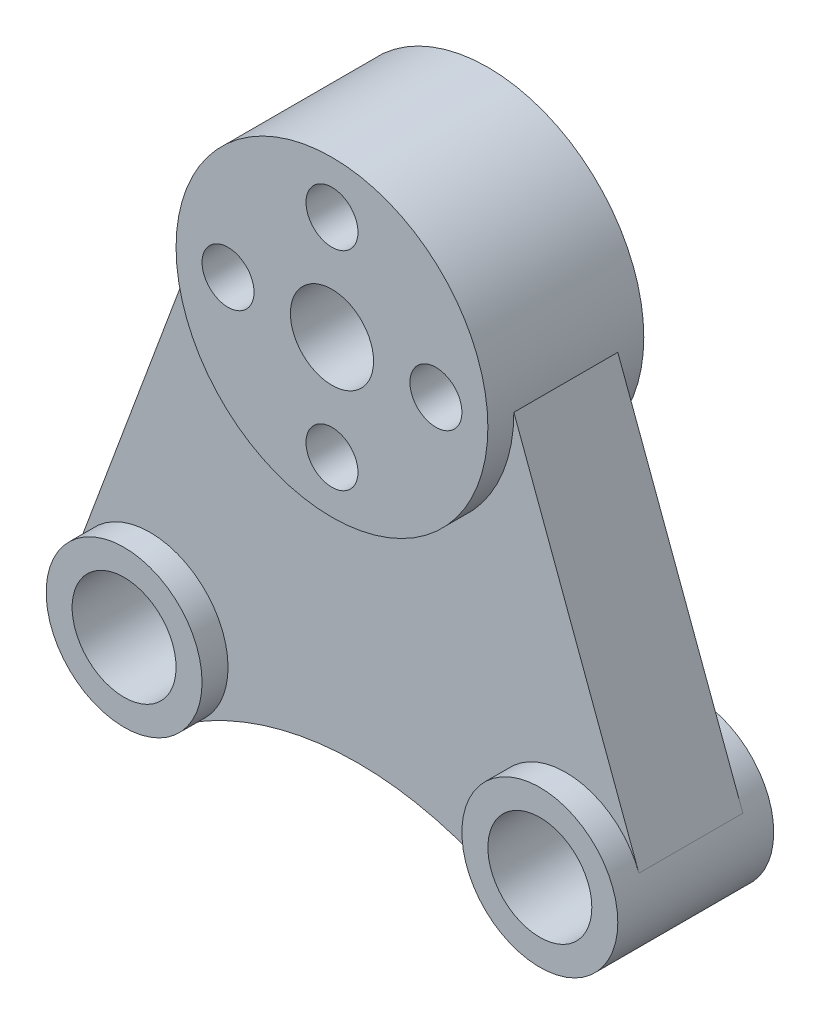
ISO-10303-21;
HEADER;
FILE_DESCRIPTION(('STEP AP214'),'2;1');
FILE_NAME('part.step','',(''),(''),'','','');
FILE_SCHEMA(('AUTOMOTIVE_DESIGN { 1 0 10303 214 1 1 1 1 }'));
ENDSEC;
DATA;
#1=APPLICATION_CONTEXT('core data for automotive mechanical design processes');
#2=APPLICATION_PROTOCOL_DEFINITION('international standard','automotive_design',2000,#1);
#3=PRODUCT_CONTEXT('',#1,'mechanical');
#4=PRODUCT('Part','Part','',(#3));
#5=PRODUCT_RELATED_PRODUCT_CATEGORY('part','',(#4));
#6=PRODUCT_DEFINITION_FORMATION('','',#4);
#7=PRODUCT_DEFINITION_CONTEXT('part definition',#1,'design');
#8=PRODUCT_DEFINITION('design','',#6,#7);
#9=PRODUCT_DEFINITION_SHAPE('','',#8);
#10=(LENGTH_UNIT() NAMED_UNIT(*) SI_UNIT(.MILLI.,.METRE.));
#11=(NAMED_UNIT(*) PLANE_ANGLE_UNIT() SI_UNIT($,.RADIAN.));
#12=(NAMED_UNIT(*) SI_UNIT($,.STERADIAN.) SOLID_ANGLE_UNIT());
#13=UNCERTAINTY_MEASURE_WITH_UNIT(LENGTH_MEASURE(1.E-05),#10,'distance_accuracy_value','');
#14=(GEOMETRIC_REPRESENTATION_CONTEXT(3) GLOBAL_UNCERTAINTY_ASSIGNED_CONTEXT((#13)) GLOBAL_UNIT_ASSIGNED_CONTEXT((#10,
#11,#12)) REPRESENTATION_CONTEXT('',''));
#15=CARTESIAN_POINT('',(0.,0.,0.));
#16=DIRECTION('',(0.,0.,1.));
#17=DIRECTION('',(1.,0.,0.));
#18=AXIS2_PLACEMENT_3D('',#15,#16,#17);
#19=CARTESIAN_POINT('',(-40.,-70.,15.));
#20=DIRECTION('',(0.,0.,-1.));
#21=DIRECTION('',(-1.,0.,0.));
#22=AXIS2_PLACEMENT_3D('',#19,#20,#21);
#23=CYLINDRICAL_SURFACE('',#22,10.);
#24=CARTESIAN_POINT('',(-40.,-70.,15.));
#25=DIRECTION('',(0.,0.,1.));
#26=DIRECTION('',(1.,0.,0.));
#27=AXIS2_PLACEMENT_3D('',#24,#25,#26);
#28=CIRCLE('',#27,10.);
#29=CARTESIAN_POINT('',(-30.,-70.,15.));
#30=VERTEX_POINT('',#29);
#31=EDGE_CURVE('E41',#30,#30,#28,.T.);
#32=ORIENTED_EDGE('',*,*,#31,.T.);
#33=EDGE_LOOP('',(#32));
#34=FACE_BOUND('',#33,.T.);
#35=CARTESIAN_POINT('',(-40.,-70.,-15.));
#36=DIRECTION('',(0.,0.,1.));
#37=DIRECTION('',(1.,0.,0.));
#38=AXIS2_PLACEMENT_3D('',#35,#36,#37);
#39=CIRCLE('',#38,10.);
#40=CARTESIAN_POINT('',(-30.,-70.,-15.));
#41=VERTEX_POINT('',#40);
#42=EDGE_CURVE('E125',#41,#41,#39,.T.);
#43=ORIENTED_EDGE('',*,*,#42,.F.);
#44=EDGE_LOOP('',(#43));
#45=FACE_BOUND('',#44,.T.);
#46=ADVANCED_FACE('F33',(#34,#45),#23,.F.);
#47=CARTESIAN_POINT('',(-40.,-70.,15.));
#48=DIRECTION('',(0.,0.,-1.));
#49=DIRECTION('',(-1.,0.,0.));
#50=AXIS2_PLACEMENT_3D('',#47,#48,#49);
#51=CYLINDRICAL_SURFACE('',#50,15.);
#52=DIRECTION('',(0.,0.,-1.));
#53=VECTOR('',#52,1.);
#54=CARTESIAN_POINT('',(-32.,-82.6885775404495,10.));
#55=LINE('',#54,#53);
#56=CARTESIAN_POINT('',(-32.,-82.6885775404495,10.));
#57=VERTEX_POINT('',#56);
#58=CARTESIAN_POINT('',(-32.,-82.6885775404495,-10.));
#59=VERTEX_POINT('',#58);
#60=EDGE_CURVE('E49',#57,#59,#55,.T.);
#61=ORIENTED_EDGE('',*,*,#60,.F.);
#62=CARTESIAN_POINT('',(-40.,-70.,10.));
#63=DIRECTION('',(0.,0.,1.));
#64=DIRECTION('',(1.,0.,0.));
#65=AXIS2_PLACEMENT_3D('',#62,#63,#64);
#66=CIRCLE('',#65,15.);
#67=CARTESIAN_POINT('',(-54.0612887091395,-64.7769587558372,10.));
#68=VERTEX_POINT('',#67);
#69=EDGE_CURVE('E54',#57,#68,#66,.T.);
#70=ORIENTED_EDGE('',*,*,#69,.T.);
#71=DIRECTION('',(0.,0.,-1.));
#72=VECTOR('',#71,1.);
#73=CARTESIAN_POINT('',(-54.0612887091395,-64.7769587558372,10.));
#74=LINE('',#73,#72);
#75=CARTESIAN_POINT('',(-54.0612887091395,-64.7769587558372,-10.));
#76=VERTEX_POINT('',#75);
#77=EDGE_CURVE('E107',#68,#76,#74,.T.);
#78=ORIENTED_EDGE('',*,*,#77,.T.);
#79=CARTESIAN_POINT('',(-40.,-70.,-10.));
#80=DIRECTION('',(0.,0.,1.));
#81=DIRECTION('',(1.,0.,0.));
#82=AXIS2_PLACEMENT_3D('',#79,#80,#81);
#83=CIRCLE('',#82,15.);
#84=EDGE_CURVE('E111',#59,#76,#83,.T.);
#85=ORIENTED_EDGE('',*,*,#84,.F.);
#86=EDGE_LOOP('',(#61,#70,#78,#85));
#87=FACE_BOUND('',#86,.T.);
#88=CARTESIAN_POINT('',(-40.,-70.,15.));
#89=DIRECTION('',(0.,0.,1.));
#90=DIRECTION('',(1.,0.,0.));
#91=AXIS2_PLACEMENT_3D('',#88,#89,#90);
#92=CIRCLE('',#91,15.);
#93=CARTESIAN_POINT('',(-25.,-70.,15.));
#94=VERTEX_POINT('',#93);
#95=EDGE_CURVE('E11',#94,#94,#92,.T.);
#96=ORIENTED_EDGE('',*,*,#95,.F.);
#97=EDGE_LOOP('',(#96));
#98=FACE_BOUND('',#97,.T.);
#99=CARTESIAN_POINT('',(-40.,-70.,-15.));
#100=DIRECTION('',(0.,0.,1.));
#101=DIRECTION('',(1.,0.,0.));
#102=AXIS2_PLACEMENT_3D('',#99,#100,#101);
#103=CIRCLE('',#102,15.);
#104=CARTESIAN_POINT('',(-25.,-70.,-15.));
#105=VERTEX_POINT('',#104);
#106=EDGE_CURVE('E36',#105,#105,#103,.T.);
#107=ORIENTED_EDGE('',*,*,#106,.T.);
#108=EDGE_LOOP('',(#107));
#109=FACE_BOUND('',#108,.T.);
#110=ADVANCED_FACE('F133',(#87,#98,#109),#51,.T.);
#111=CARTESIAN_POINT('',(0.,0.,15.));
#112=DIRECTION('',(0.,0.,1.));
#113=DIRECTION('',(1.,0.,0.));
#114=AXIS2_PLACEMENT_3D('',#111,#112,#113);
#115=PLANE('',#114);
#116=ORIENTED_EDGE('',*,*,#31,.F.);
#117=EDGE_LOOP('',(#116));
#118=FACE_BOUND('',#117,.T.);
#119=ORIENTED_EDGE('',*,*,#95,.T.);
#120=EDGE_LOOP('',(#119));
#121=FACE_BOUND('',#120,.T.);
#122=ADVANCED_FACE('F138',(#118,#121),#115,.T.);
#123=CARTESIAN_POINT('',(0.,0.,-15.));
#124=DIRECTION('',(0.,0.,1.));
#125=DIRECTION('',(1.,0.,0.));
#126=AXIS2_PLACEMENT_3D('',#123,#124,#125);
#127=PLANE('',#126);
#128=ORIENTED_EDGE('',*,*,#42,.T.);
#129=EDGE_LOOP('',(#128));
#130=FACE_BOUND('',#129,.T.);
#131=ORIENTED_EDGE('',*,*,#106,.F.);
#132=EDGE_LOOP('',(#131));
#133=FACE_BOUND('',#132,.T.);
#134=ADVANCED_FACE('F135',(#130,#133),#127,.F.);
#135=CARTESIAN_POINT('',(0.,-133.442887702248,10.));
#136=DIRECTION('',(0.,0.,-1.));
#137=DIRECTION('',(-1.,0.,0.));
#138=AXIS2_PLACEMENT_3D('',#135,#136,#137);
#139=CYLINDRICAL_SURFACE('',#138,60.);
#140=CARTESIAN_POINT('',(0.,-133.442887702248,-10.));
#141=DIRECTION('',(0.,0.,1.));
#142=DIRECTION('',(1.,0.,0.));
#143=AXIS2_PLACEMENT_3D('',#140,#141,#142);
#144=CIRCLE('',#143,60.);
#145=CARTESIAN_POINT('',(32.,-82.6885775404495,-10.));
#146=VERTEX_POINT('',#145);
#147=EDGE_CURVE('E340',#59,#146,#144,.F.);
#148=ORIENTED_EDGE('',*,*,#147,.T.);
#149=DIRECTION('',(0.,0.,-1.));
#150=VECTOR('',#149,1.);
#151=CARTESIAN_POINT('',(32.,-82.6885775404495,10.));
#152=LINE('',#151,#150);
#153=CARTESIAN_POINT('',(32.,-82.6885775404495,10.));
#154=VERTEX_POINT('',#153);
#155=EDGE_CURVE('E122',#154,#146,#152,.T.);
#156=ORIENTED_EDGE('',*,*,#155,.F.);
#157=CARTESIAN_POINT('',(0.,-133.442887702248,10.));
#158=DIRECTION('',(0.,0.,1.));
#159=DIRECTION('',(1.,0.,0.));
#160=AXIS2_PLACEMENT_3D('',#157,#158,#159);
#161=CIRCLE('',#160,60.);
#162=EDGE_CURVE('E113',#57,#154,#161,.F.);
#163=ORIENTED_EDGE('',*,*,#162,.F.);
#164=ORIENTED_EDGE('',*,*,#60,.T.);
#165=EDGE_LOOP('',(#148,#156,#163,#164));
#166=FACE_BOUND('',#165,.T.);
#167=ADVANCED_FACE('F137',(#166),#139,.F.);
#168=CARTESIAN_POINT('',(26.3626453549032,9.79235878318883,10.));
#169=DIRECTION('',(0.937419247275968,0.348202749610853,0.));
#170=DIRECTION('',(-0.348202749610853,0.937419247275968,0.));
#171=AXIS2_PLACEMENT_3D('',#168,#169,#170);
#172=PLANE('',#171);
#173=DIRECTION('',(0.348202749610853,-0.937419247275968,0.));
#174=VECTOR('',#173,1.);
#175=CARTESIAN_POINT('',(26.3626453549032,9.79235878318883,-10.));
#176=LINE('',#175,#174);
#177=CARTESIAN_POINT('',(30.,0.,-10.));
#178=VERTEX_POINT('',#177);
#179=CARTESIAN_POINT('',(54.0612887091395,-64.7769587558372,-10.));
#180=VERTEX_POINT('',#179);
#181=EDGE_CURVE('E98',#178,#180,#176,.T.);
#182=ORIENTED_EDGE('',*,*,#181,.F.);
#183=DIRECTION('',(0.,0.,-1.));
#184=VECTOR('',#183,1.);
#185=CARTESIAN_POINT('',(30.,0.,10.));
#186=LINE('',#185,#184);
#187=CARTESIAN_POINT('',(30.,0.,10.));
#188=VERTEX_POINT('',#187);
#189=EDGE_CURVE('E92',#188,#178,#186,.T.);
#190=ORIENTED_EDGE('',*,*,#189,.F.);
#191=DIRECTION('',(0.348202749610853,-0.937419247275968,0.));
#192=VECTOR('',#191,1.);
#193=CARTESIAN_POINT('',(26.3626453549032,9.79235878318883,10.));
#194=LINE('',#193,#192);
#195=CARTESIAN_POINT('',(54.0612887091395,-64.7769587558372,10.));
#196=VERTEX_POINT('',#195);
#197=EDGE_CURVE('E349',#188,#196,#194,.T.);
#198=ORIENTED_EDGE('',*,*,#197,.T.);
#199=DIRECTION('',(0.,0.,-1.));
#200=VECTOR('',#199,1.);
#201=CARTESIAN_POINT('',(54.0612887091395,-64.7769587558372,10.));
#202=LINE('',#201,#200);
#203=EDGE_CURVE('E119',#196,#180,#202,.T.);
#204=ORIENTED_EDGE('',*,*,#203,.T.);
#205=EDGE_LOOP('',(#182,#190,#198,#204));
#206=FACE_BOUND('',#205,.T.);
#207=ADVANCED_FACE('F144',(#206),#172,.T.);
#208=CARTESIAN_POINT('',(-26.3626453549033,9.79235878318883,10.));
#209=DIRECTION('',(0.937419247275968,-0.348202749610853,0.));
#210=DIRECTION('',(0.348202749610853,0.937419247275968,0.));
#211=AXIS2_PLACEMENT_3D('',#208,#209,#210);
#212=PLANE('',#211);
#213=DIRECTION('',(-0.348202749610853,-0.937419247275968,0.));
#214=VECTOR('',#213,1.);
#215=CARTESIAN_POINT('',(-26.3626453549033,9.79235878318883,-10.));
#216=LINE('',#215,#214);
#217=CARTESIAN_POINT('',(-30.,0.,-10.));
#218=VERTEX_POINT('',#217);
#219=EDGE_CURVE('E97',#218,#76,#216,.T.);
#220=ORIENTED_EDGE('',*,*,#219,.T.);
#221=ORIENTED_EDGE('',*,*,#77,.F.);
#222=DIRECTION('',(-0.348202749610853,-0.937419247275968,0.));
#223=VECTOR('',#222,1.);
#224=CARTESIAN_POINT('',(-26.3626453549033,9.79235878318883,10.));
#225=LINE('',#224,#223);
#226=CARTESIAN_POINT('',(-30.,0.,10.));
#227=VERTEX_POINT('',#226);
#228=EDGE_CURVE('E105',#227,#68,#225,.T.);
#229=ORIENTED_EDGE('',*,*,#228,.F.);
#230=DIRECTION('',(0.,0.,-1.));
#231=VECTOR('',#230,1.);
#232=CARTESIAN_POINT('',(-30.,0.,10.));
#233=LINE('',#232,#231);
#234=EDGE_CURVE('E89',#227,#218,#233,.T.);
#235=ORIENTED_EDGE('',*,*,#234,.T.);
#236=EDGE_LOOP('',(#220,#221,#229,#235));
#237=FACE_BOUND('',#236,.T.);
#238=ADVANCED_FACE('F102',(#237),#212,.F.);
#239=CARTESIAN_POINT('',(0.,0.,10.));
#240=DIRECTION('',(0.,0.,1.));
#241=DIRECTION('',(1.,0.,0.));
#242=AXIS2_PLACEMENT_3D('',#239,#240,#241);
#243=PLANE('',#242);
#244=ORIENTED_EDGE('',*,*,#69,.F.);
#245=ORIENTED_EDGE('',*,*,#162,.T.);
#246=CARTESIAN_POINT('',(40.,-70.,10.));
#247=DIRECTION('',(0.,0.,1.));
#248=DIRECTION('',(1.,0.,0.));
#249=AXIS2_PLACEMENT_3D('',#246,#247,#248);
#250=CIRCLE('',#249,15.);
#251=EDGE_CURVE('E351',#196,#154,#250,.T.);
#252=ORIENTED_EDGE('',*,*,#251,.F.);
#253=ORIENTED_EDGE('',*,*,#197,.F.);
#254=CARTESIAN_POINT('',(0.,0.,10.));
#255=DIRECTION('',(0.,0.,1.));
#256=DIRECTION('',(1.,0.,0.));
#257=AXIS2_PLACEMENT_3D('',#254,#255,#256);
#258=CIRCLE('',#257,30.);
#259=EDGE_CURVE('E338',#227,#188,#258,.T.);
#260=ORIENTED_EDGE('',*,*,#259,.F.);
#261=ORIENTED_EDGE('',*,*,#228,.T.);
#262=EDGE_LOOP('',(#244,#245,#252,#253,#260,#261));
#263=FACE_BOUND('',#262,.T.);
#264=ADVANCED_FACE('F301',(#263),#243,.T.);
#265=CARTESIAN_POINT('',(0.,0.,-10.));
#266=DIRECTION('',(0.,0.,1.));
#267=DIRECTION('',(1.,0.,0.));
#268=AXIS2_PLACEMENT_3D('',#265,#266,#267);
#269=PLANE('',#268);
#270=ORIENTED_EDGE('',*,*,#84,.T.);
#271=ORIENTED_EDGE('',*,*,#219,.F.);
#272=CARTESIAN_POINT('',(0.,0.,-10.));
#273=DIRECTION('',(0.,0.,1.));
#274=DIRECTION('',(1.,0.,0.));
#275=AXIS2_PLACEMENT_3D('',#272,#273,#274);
#276=CIRCLE('',#275,30.);
#277=EDGE_CURVE('E85',#218,#178,#276,.T.);
#278=ORIENTED_EDGE('',*,*,#277,.T.);
#279=ORIENTED_EDGE('',*,*,#181,.T.);
#280=CARTESIAN_POINT('',(40.,-70.,-10.));
#281=DIRECTION('',(0.,0.,1.));
#282=DIRECTION('',(1.,0.,0.));
#283=AXIS2_PLACEMENT_3D('',#280,#281,#282);
#284=CIRCLE('',#283,15.);
#285=EDGE_CURVE('E345',#180,#146,#284,.T.);
#286=ORIENTED_EDGE('',*,*,#285,.T.);
#287=ORIENTED_EDGE('',*,*,#147,.F.);
#288=EDGE_LOOP('',(#270,#271,#278,#279,#286,#287));
#289=FACE_BOUND('',#288,.T.);
#290=ADVANCED_FACE('F109',(#289),#269,.F.);
#291=CARTESIAN_POINT('',(40.,-70.,15.));
#292=DIRECTION('',(0.,0.,-1.));
#293=DIRECTION('',(-1.,0.,0.));
#294=AXIS2_PLACEMENT_3D('',#291,#292,#293);
#295=CYLINDRICAL_SURFACE('',#294,10.);
#296=CARTESIAN_POINT('',(40.,-70.,15.));
#297=DIRECTION('',(0.,0.,1.));
#298=DIRECTION('',(1.,0.,0.));
#299=AXIS2_PLACEMENT_3D('',#296,#297,#298);
#300=CIRCLE('',#299,10.);
#301=CARTESIAN_POINT('',(50.,-70.,15.));
#302=VERTEX_POINT('',#301);
#303=EDGE_CURVE('E360',#302,#302,#300,.T.);
#304=ORIENTED_EDGE('',*,*,#303,.T.);
#305=EDGE_LOOP('',(#304));
#306=FACE_BOUND('',#305,.T.);
#307=CARTESIAN_POINT('',(40.,-70.,-15.));
#308=DIRECTION('',(0.,0.,1.));
#309=DIRECTION('',(1.,0.,0.));
#310=AXIS2_PLACEMENT_3D('',#307,#308,#309);
#311=CIRCLE('',#310,10.);
#312=CARTESIAN_POINT('',(50.,-70.,-15.));
#313=VERTEX_POINT('',#312);
#314=EDGE_CURVE('E361',#313,#313,#311,.T.);
#315=ORIENTED_EDGE('',*,*,#314,.F.);
#316=EDGE_LOOP('',(#315));
#317=FACE_BOUND('',#316,.T.);
#318=ADVANCED_FACE('F177',(#306,#317),#295,.F.);
#319=CARTESIAN_POINT('',(40.,-70.,15.));
#320=DIRECTION('',(0.,0.,-1.));
#321=DIRECTION('',(-1.,0.,0.));
#322=AXIS2_PLACEMENT_3D('',#319,#320,#321);
#323=CYLINDRICAL_SURFACE('',#322,15.);
#324=ORIENTED_EDGE('',*,*,#251,.T.);
#325=ORIENTED_EDGE('',*,*,#155,.T.);
#326=ORIENTED_EDGE('',*,*,#285,.F.);
#327=ORIENTED_EDGE('',*,*,#203,.F.);
#328=EDGE_LOOP('',(#324,#325,#326,#327));
#329=FACE_BOUND('',#328,.T.);
#330=CARTESIAN_POINT('',(40.,-70.,15.));
#331=DIRECTION('',(0.,0.,1.));
#332=DIRECTION('',(1.,0.,0.));
#333=AXIS2_PLACEMENT_3D('',#330,#331,#332);
#334=CIRCLE('',#333,15.);
#335=CARTESIAN_POINT('',(55.,-70.,15.));
#336=VERTEX_POINT('',#335);
#337=EDGE_CURVE('E341',#336,#336,#334,.T.);
#338=ORIENTED_EDGE('',*,*,#337,.F.);
#339=EDGE_LOOP('',(#338));
#340=FACE_BOUND('',#339,.T.);
#341=CARTESIAN_POINT('',(40.,-70.,-15.));
#342=DIRECTION('',(0.,0.,1.));
#343=DIRECTION('',(1.,0.,0.));
#344=AXIS2_PLACEMENT_3D('',#341,#342,#343);
#345=CIRCLE('',#344,15.);
#346=CARTESIAN_POINT('',(55.,-70.,-15.));
#347=VERTEX_POINT('',#346);
#348=EDGE_CURVE('E357',#347,#347,#345,.T.);
#349=ORIENTED_EDGE('',*,*,#348,.T.);
#350=EDGE_LOOP('',(#349));
#351=FACE_BOUND('',#350,.T.);
#352=ADVANCED_FACE('F183',(#329,#340,#351),#323,.T.);
#353=CARTESIAN_POINT('',(0.,0.,15.));
#354=DIRECTION('',(0.,0.,1.));
#355=DIRECTION('',(1.,0.,0.));
#356=AXIS2_PLACEMENT_3D('',#353,#354,#355);
#357=PLANE('',#356);
#358=ORIENTED_EDGE('',*,*,#303,.F.);
#359=EDGE_LOOP('',(#358));
#360=FACE_BOUND('',#359,.T.);
#361=ORIENTED_EDGE('',*,*,#337,.T.);
#362=EDGE_LOOP('',(#361));
#363=FACE_BOUND('',#362,.T.);
#364=ADVANCED_FACE('F193',(#360,#363),#357,.T.);
#365=CARTESIAN_POINT('',(0.,0.,-15.));
#366=DIRECTION('',(0.,0.,1.));
#367=DIRECTION('',(1.,0.,0.));
#368=AXIS2_PLACEMENT_3D('',#365,#366,#367);
#369=PLANE('',#368);
#370=ORIENTED_EDGE('',*,*,#314,.T.);
#371=EDGE_LOOP('',(#370));
#372=FACE_BOUND('',#371,.T.);
#373=ORIENTED_EDGE('',*,*,#348,.F.);
#374=EDGE_LOOP('',(#373));
#375=FACE_BOUND('',#374,.T.);
#376=ADVANCED_FACE('F202',(#372,#375),#369,.F.);
#377=CARTESIAN_POINT('',(0.,0.,15.));
#378=DIRECTION('',(0.,0.,-1.));
#379=DIRECTION('',(-1.,0.,0.));
#380=AXIS2_PLACEMENT_3D('',#377,#378,#379);
#381=CYLINDRICAL_SURFACE('',#380,8.);
#382=CARTESIAN_POINT('',(0.,0.,15.));
#383=DIRECTION('',(0.,0.,1.));
#384=DIRECTION('',(1.,0.,0.));
#385=AXIS2_PLACEMENT_3D('',#382,#383,#384);
#386=CIRCLE('',#385,8.);
#387=CARTESIAN_POINT('',(8.,0.,15.));
#388=VERTEX_POINT('',#387);
#389=EDGE_CURVE('E390',#388,#388,#386,.T.);
#390=ORIENTED_EDGE('',*,*,#389,.T.);
#391=EDGE_LOOP('',(#390));
#392=FACE_BOUND('',#391,.T.);
#393=CARTESIAN_POINT('',(0.,0.,-15.));
#394=DIRECTION('',(0.,0.,1.));
#395=DIRECTION('',(1.,0.,0.));
#396=AXIS2_PLACEMENT_3D('',#393,#394,#395);
#397=CIRCLE('',#396,8.);
#398=CARTESIAN_POINT('',(8.,0.,-15.));
#399=VERTEX_POINT('',#398);
#400=EDGE_CURVE('E373',#399,#399,#397,.T.);
#401=ORIENTED_EDGE('',*,*,#400,.F.);
#402=EDGE_LOOP('',(#401));
#403=FACE_BOUND('',#402,.T.);
#404=ADVANCED_FACE('F211',(#392,#403),#381,.F.);
#405=CARTESIAN_POINT('',(0.,20.,15.));
#406=DIRECTION('',(0.,0.,-1.));
#407=DIRECTION('',(-1.,0.,0.));
#408=AXIS2_PLACEMENT_3D('',#405,#406,#407);
#409=CYLINDRICAL_SURFACE('',#408,5.);
#410=CARTESIAN_POINT('',(0.,20.,15.));
#411=DIRECTION('',(0.,0.,1.));
#412=DIRECTION('',(1.,0.,0.));
#413=AXIS2_PLACEMENT_3D('',#410,#411,#412);
#414=CIRCLE('',#413,5.);
#415=CARTESIAN_POINT('',(5.,20.,15.));
#416=VERTEX_POINT('',#415);
#417=EDGE_CURVE('E393',#416,#416,#414,.T.);
#418=ORIENTED_EDGE('',*,*,#417,.T.);
#419=EDGE_LOOP('',(#418));
#420=FACE_BOUND('',#419,.T.);
#421=CARTESIAN_POINT('',(0.,20.,-15.));
#422=DIRECTION('',(0.,0.,1.));
#423=DIRECTION('',(1.,0.,0.));
#424=AXIS2_PLACEMENT_3D('',#421,#422,#423);
#425=CIRCLE('',#424,5.);
#426=CARTESIAN_POINT('',(5.,20.,-15.));
#427=VERTEX_POINT('',#426);
#428=EDGE_CURVE('E376',#427,#427,#425,.T.);
#429=ORIENTED_EDGE('',*,*,#428,.F.);
#430=EDGE_LOOP('',(#429));
#431=FACE_BOUND('',#430,.T.);
#432=ADVANCED_FACE('F220',(#420,#431),#409,.F.);
#433=CARTESIAN_POINT('',(-20.,0.,15.));
#434=DIRECTION('',(0.,0.,-1.));
#435=DIRECTION('',(-1.,0.,0.));
#436=AXIS2_PLACEMENT_3D('',#433,#434,#435);
#437=CYLINDRICAL_SURFACE('',#436,5.);
#438=CARTESIAN_POINT('',(-20.,0.,15.));
#439=DIRECTION('',(0.,0.,1.));
#440=DIRECTION('',(1.,0.,0.));
#441=AXIS2_PLACEMENT_3D('',#438,#439,#440);
#442=CIRCLE('',#441,5.);
#443=CARTESIAN_POINT('',(-15.,0.,15.));
#444=VERTEX_POINT('',#443);
#445=EDGE_CURVE('E396',#444,#444,#442,.T.);
#446=ORIENTED_EDGE('',*,*,#445,.T.);
#447=EDGE_LOOP('',(#446));
#448=FACE_BOUND('',#447,.T.);
#449=CARTESIAN_POINT('',(-20.,0.,-15.));
#450=DIRECTION('',(0.,0.,1.));
#451=DIRECTION('',(1.,0.,0.));
#452=AXIS2_PLACEMENT_3D('',#449,#450,#451);
#453=CIRCLE('',#452,5.);
#454=CARTESIAN_POINT('',(-15.,0.,-15.));
#455=VERTEX_POINT('',#454);
#456=EDGE_CURVE('E379',#455,#455,#453,.T.);
#457=ORIENTED_EDGE('',*,*,#456,.F.);
#458=EDGE_LOOP('',(#457));
#459=FACE_BOUND('',#458,.T.);
#460=ADVANCED_FACE('F229',(#448,#459),#437,.F.);
#461=CARTESIAN_POINT('',(0.,-20.,15.));
#462=DIRECTION('',(0.,0.,-1.));
#463=DIRECTION('',(-1.,0.,0.));
#464=AXIS2_PLACEMENT_3D('',#461,#462,#463);
#465=CYLINDRICAL_SURFACE('',#464,5.);
#466=CARTESIAN_POINT('',(0.,-20.,15.));
#467=DIRECTION('',(0.,0.,1.));
#468=DIRECTION('',(1.,0.,0.));
#469=AXIS2_PLACEMENT_3D('',#466,#467,#468);
#470=CIRCLE('',#469,5.);
#471=CARTESIAN_POINT('',(5.,-20.,15.));
#472=VERTEX_POINT('',#471);
#473=EDGE_CURVE('E399',#472,#472,#470,.T.);
#474=ORIENTED_EDGE('',*,*,#473,.T.);
#475=EDGE_LOOP('',(#474));
#476=FACE_BOUND('',#475,.T.);
#477=CARTESIAN_POINT('',(0.,-20.,-15.));
#478=DIRECTION('',(0.,0.,1.));
#479=DIRECTION('',(1.,0.,0.));
#480=AXIS2_PLACEMENT_3D('',#477,#478,#479);
#481=CIRCLE('',#480,5.);
#482=CARTESIAN_POINT('',(5.,-20.,-15.));
#483=VERTEX_POINT('',#482);
#484=EDGE_CURVE('E382',#483,#483,#481,.T.);
#485=ORIENTED_EDGE('',*,*,#484,.F.);
#486=EDGE_LOOP('',(#485));
#487=FACE_BOUND('',#486,.T.);
#488=ADVANCED_FACE('F238',(#476,#487),#465,.F.);
#489=CARTESIAN_POINT('',(20.,0.,15.));
#490=DIRECTION('',(0.,0.,-1.));
#491=DIRECTION('',(-1.,0.,0.));
#492=AXIS2_PLACEMENT_3D('',#489,#490,#491);
#493=CYLINDRICAL_SURFACE('',#492,5.);
#494=CARTESIAN_POINT('',(20.,0.,15.));
#495=DIRECTION('',(0.,0.,1.));
#496=DIRECTION('',(1.,0.,0.));
#497=AXIS2_PLACEMENT_3D('',#494,#495,#496);
#498=CIRCLE('',#497,5.);
#499=CARTESIAN_POINT('',(25.,0.,15.));
#500=VERTEX_POINT('',#499);
#501=EDGE_CURVE('E372',#500,#500,#498,.T.);
#502=ORIENTED_EDGE('',*,*,#501,.T.);
#503=EDGE_LOOP('',(#502));
#504=FACE_BOUND('',#503,.T.);
#505=CARTESIAN_POINT('',(20.,0.,-15.));
#506=DIRECTION('',(0.,0.,1.));
#507=DIRECTION('',(1.,0.,0.));
#508=AXIS2_PLACEMENT_3D('',#505,#506,#507);
#509=CIRCLE('',#508,5.);
#510=CARTESIAN_POINT('',(25.,0.,-15.));
#511=VERTEX_POINT('',#510);
#512=EDGE_CURVE('E385',#511,#511,#509,.T.);
#513=ORIENTED_EDGE('',*,*,#512,.F.);
#514=EDGE_LOOP('',(#513));
#515=FACE_BOUND('',#514,.T.);
#516=ADVANCED_FACE('F247',(#504,#515),#493,.F.);
#517=CARTESIAN_POINT('',(0.,0.,15.));
#518=DIRECTION('',(0.,0.,-1.));
#519=DIRECTION('',(-1.,0.,0.));
#520=AXIS2_PLACEMENT_3D('',#517,#518,#519);
#521=CYLINDRICAL_SURFACE('',#520,30.);
#522=ORIENTED_EDGE('',*,*,#259,.T.);
#523=ORIENTED_EDGE('',*,*,#189,.T.);
#524=ORIENTED_EDGE('',*,*,#277,.F.);
#525=ORIENTED_EDGE('',*,*,#234,.F.);
#526=EDGE_LOOP('',(#522,#523,#524,#525));
#527=FACE_BOUND('',#526,.T.);
#528=CARTESIAN_POINT('',(0.,0.,15.));
#529=DIRECTION('',(0.,0.,1.));
#530=DIRECTION('',(1.,0.,0.));
#531=AXIS2_PLACEMENT_3D('',#528,#529,#530);
#532=CIRCLE('',#531,30.);
#533=CARTESIAN_POINT('',(30.,0.,15.));
#534=VERTEX_POINT('',#533);
#535=EDGE_CURVE('E364',#534,#534,#532,.T.);
#536=ORIENTED_EDGE('',*,*,#535,.F.);
#537=EDGE_LOOP('',(#536));
#538=FACE_BOUND('',#537,.T.);
#539=CARTESIAN_POINT('',(0.,0.,-15.));
#540=DIRECTION('',(0.,0.,1.));
#541=DIRECTION('',(1.,0.,0.));
#542=AXIS2_PLACEMENT_3D('',#539,#540,#541);
#543=CIRCLE('',#542,30.);
#544=CARTESIAN_POINT('',(30.,0.,-15.));
#545=VERTEX_POINT('',#544);
#546=EDGE_CURVE('E369',#545,#545,#543,.T.);
#547=ORIENTED_EDGE('',*,*,#546,.T.);
#548=EDGE_LOOP('',(#547));
#549=FACE_BOUND('',#548,.T.);
#550=ADVANCED_FACE('F87',(#527,#538,#549),#521,.T.);
#551=CARTESIAN_POINT('',(0.,0.,15.));
#552=DIRECTION('',(0.,0.,1.));
#553=DIRECTION('',(1.,0.,0.));
#554=AXIS2_PLACEMENT_3D('',#551,#552,#553);
#555=PLANE('',#554);
#556=ORIENTED_EDGE('',*,*,#501,.F.);
#557=EDGE_LOOP('',(#556));
#558=FACE_BOUND('',#557,.T.);
#559=ORIENTED_EDGE('',*,*,#473,.F.);
#560=EDGE_LOOP('',(#559));
#561=FACE_BOUND('',#560,.T.);
#562=ORIENTED_EDGE('',*,*,#445,.F.);
#563=EDGE_LOOP('',(#562));
#564=FACE_BOUND('',#563,.T.);
#565=ORIENTED_EDGE('',*,*,#417,.F.);
#566=EDGE_LOOP('',(#565));
#567=FACE_BOUND('',#566,.T.);
#568=ORIENTED_EDGE('',*,*,#389,.F.);
#569=EDGE_LOOP('',(#568));
#570=FACE_BOUND('',#569,.T.);
#571=ORIENTED_EDGE('',*,*,#535,.T.);
#572=EDGE_LOOP('',(#571));
#573=FACE_BOUND('',#572,.T.);
#574=ADVANCED_FACE('F264',(#558,#561,#564,#567,#570,#573),#555,.T.);
#575=CARTESIAN_POINT('',(0.,0.,-15.));
#576=DIRECTION('',(0.,0.,1.));
#577=DIRECTION('',(1.,0.,0.));
#578=AXIS2_PLACEMENT_3D('',#575,#576,#577);
#579=PLANE('',#578);
#580=ORIENTED_EDGE('',*,*,#512,.T.);
#581=EDGE_LOOP('',(#580));
#582=FACE_BOUND('',#581,.T.);
#583=ORIENTED_EDGE('',*,*,#484,.T.);
#584=EDGE_LOOP('',(#583));
#585=FACE_BOUND('',#584,.T.);
#586=ORIENTED_EDGE('',*,*,#456,.T.);
#587=EDGE_LOOP('',(#586));
#588=FACE_BOUND('',#587,.T.);
#589=ORIENTED_EDGE('',*,*,#428,.T.);
#590=EDGE_LOOP('',(#589));
#591=FACE_BOUND('',#590,.T.);
#592=ORIENTED_EDGE('',*,*,#400,.T.);
#593=EDGE_LOOP('',(#592));
#594=FACE_BOUND('',#593,.T.);
#595=ORIENTED_EDGE('',*,*,#546,.F.);
#596=EDGE_LOOP('',(#595));
#597=FACE_BOUND('',#596,.T.);
#598=ADVANCED_FACE('F272',(#582,#585,#588,#591,#594,#597),#579,.F.);
#599=CLOSED_SHELL('',(#46,#110,#122,#134,#167,#207,#238,#264,#290,#318,#352,#364,#376,#404,#432,
#460,#488,#516,#550,#574,#598));
#600=MANIFOLD_SOLID_BREP('B2',#599);
#601=ADVANCED_BREP_SHAPE_REPRESENTATION('',(#18,#600),#14);
#602=SHAPE_DEFINITION_REPRESENTATION(#9,#601);
ENDSEC;
END-ISO-10303-21;
